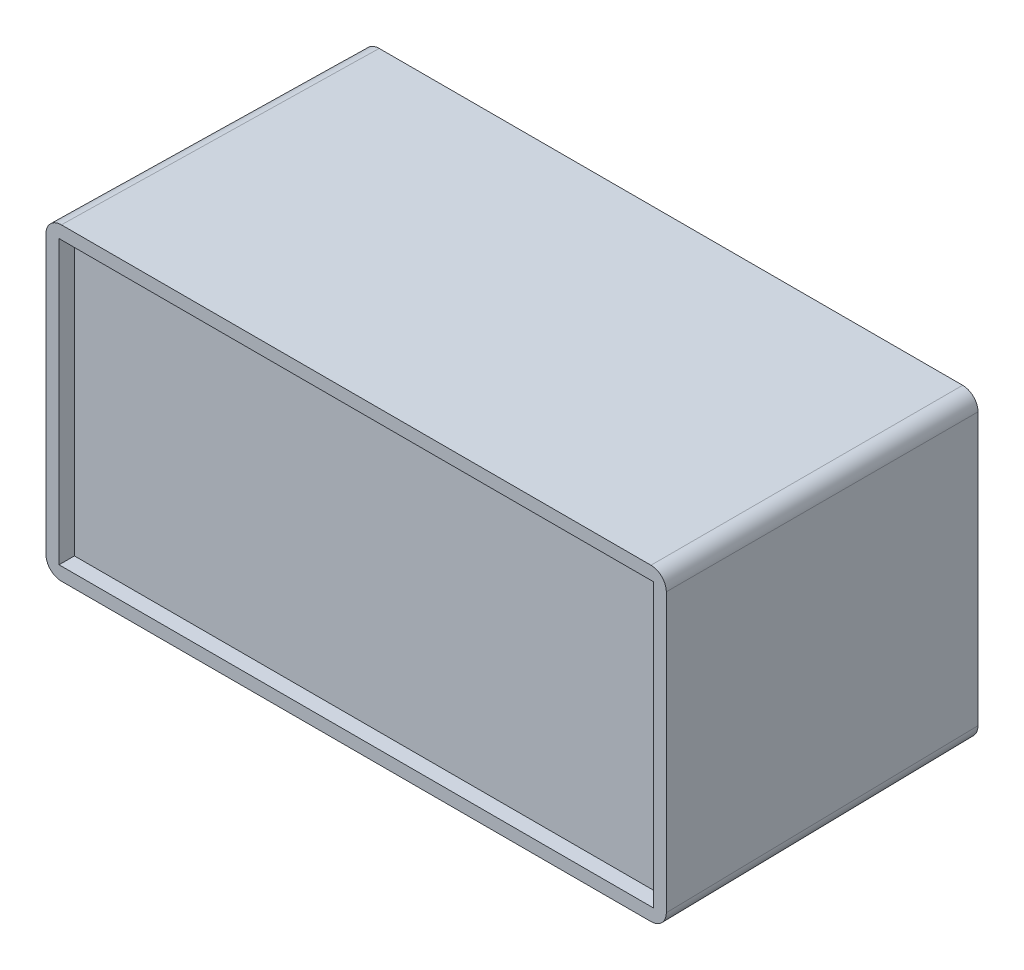
ISO-10303-21;
HEADER;
FILE_DESCRIPTION(('STEP AP214'),'2;1');
FILE_NAME('part.step','',(''),(''),'','','');
FILE_SCHEMA(('AUTOMOTIVE_DESIGN { 1 0 10303 214 1 1 1 1 }'));
ENDSEC;
DATA;
#1=APPLICATION_CONTEXT('core data for automotive mechanical design processes');
#2=APPLICATION_PROTOCOL_DEFINITION('international standard','automotive_design',2000,#1);
#3=PRODUCT_CONTEXT('',#1,'mechanical');
#4=PRODUCT('Part','Part','',(#3));
#5=PRODUCT_RELATED_PRODUCT_CATEGORY('part','',(#4));
#6=PRODUCT_DEFINITION_FORMATION('','',#4);
#7=PRODUCT_DEFINITION_CONTEXT('part definition',#1,'design');
#8=PRODUCT_DEFINITION('design','',#6,#7);
#9=PRODUCT_DEFINITION_SHAPE('','',#8);
#10=(LENGTH_UNIT() NAMED_UNIT(*) SI_UNIT(.MILLI.,.METRE.));
#11=(NAMED_UNIT(*) PLANE_ANGLE_UNIT() SI_UNIT($,.RADIAN.));
#12=(NAMED_UNIT(*) SI_UNIT($,.STERADIAN.) SOLID_ANGLE_UNIT());
#13=UNCERTAINTY_MEASURE_WITH_UNIT(LENGTH_MEASURE(1.E-05),#10,'distance_accuracy_value','');
#14=(GEOMETRIC_REPRESENTATION_CONTEXT(3) GLOBAL_UNCERTAINTY_ASSIGNED_CONTEXT((#13)) GLOBAL_UNIT_ASSIGNED_CONTEXT((#10,
#11,#12)) REPRESENTATION_CONTEXT('',''));
#15=CARTESIAN_POINT('',(0.,0.,0.));
#16=DIRECTION('',(0.,0.,1.));
#17=DIRECTION('',(1.,0.,0.));
#18=AXIS2_PLACEMENT_3D('',#15,#16,#17);
#19=CARTESIAN_POINT('',(0.,0.,19.5));
#20=DIRECTION('',(0.,0.,-1.));
#21=DIRECTION('',(-1.,0.,0.));
#22=AXIS2_PLACEMENT_3D('',#19,#20,#21);
#23=PLANE('',#22);
#24=DIRECTION('',(1.,0.,0.));
#25=VECTOR('',#24,1.);
#26=CARTESIAN_POINT('',(19.35,9.2,19.5));
#27=LINE('',#26,#25);
#28=CARTESIAN_POINT('',(19.35,9.2,19.5));
#29=VERTEX_POINT('',#28);
#30=CARTESIAN_POINT('',(-19.35,9.2,19.5));
#31=VERTEX_POINT('',#30);
#32=EDGE_CURVE('E166',#29,#31,#27,.F.);
#33=ORIENTED_EDGE('',*,*,#32,.T.);
#34=DIRECTION('',(0.,1.,0.));
#35=VECTOR('',#34,1.);
#36=CARTESIAN_POINT('',(-19.35,9.2,19.5));
#37=LINE('',#36,#35);
#38=CARTESIAN_POINT('',(-19.35,-9.2,19.5));
#39=VERTEX_POINT('',#38);
#40=EDGE_CURVE('E151',#31,#39,#37,.F.);
#41=ORIENTED_EDGE('',*,*,#40,.T.);
#42=DIRECTION('',(1.,0.,0.));
#43=VECTOR('',#42,1.);
#44=CARTESIAN_POINT('',(19.35,-9.2,19.5));
#45=LINE('',#44,#43);
#46=CARTESIAN_POINT('',(19.35,-9.2,19.5));
#47=VERTEX_POINT('',#46);
#48=EDGE_CURVE('E157',#39,#47,#45,.T.);
#49=ORIENTED_EDGE('',*,*,#48,.T.);
#50=DIRECTION('',(0.,1.,0.));
#51=VECTOR('',#50,1.);
#52=CARTESIAN_POINT('',(19.35,9.2,19.5));
#53=LINE('',#52,#51);
#54=EDGE_CURVE('E163',#47,#29,#53,.T.);
#55=ORIENTED_EDGE('',*,*,#54,.T.);
#56=EDGE_LOOP('',(#33,#41,#49,#55));
#57=FACE_BOUND('',#56,.T.);
#58=ADVANCED_FACE('F17',(#57),#23,.F.);
#59=CARTESIAN_POINT('',(19.35,9.2,19.5));
#60=DIRECTION('',(0.,1.,0.));
#61=DIRECTION('',(0.,0.,1.));
#62=AXIS2_PLACEMENT_3D('',#59,#60,#61);
#63=PLANE('',#62);
#64=DIRECTION('',(1.,0.,0.));
#65=VECTOR('',#64,1.);
#66=CARTESIAN_POINT('',(0.,9.2,20.5));
#67=LINE('',#66,#65);
#68=CARTESIAN_POINT('',(-19.35,9.2,20.5));
#69=VERTEX_POINT('',#68);
#70=CARTESIAN_POINT('',(19.35,9.2,20.5));
#71=VERTEX_POINT('',#70);
#72=EDGE_CURVE('E131',#69,#71,#67,.T.);
#73=ORIENTED_EDGE('',*,*,#72,.F.);
#74=DIRECTION('',(0.,0.,1.));
#75=VECTOR('',#74,1.);
#76=CARTESIAN_POINT('',(-19.35,9.2,19.5));
#77=LINE('',#76,#75);
#78=EDGE_CURVE('E145',#69,#31,#77,.F.);
#79=ORIENTED_EDGE('',*,*,#78,.T.);
#80=ORIENTED_EDGE('',*,*,#32,.F.);
#81=DIRECTION('',(0.,0.,-1.));
#82=VECTOR('',#81,1.);
#83=CARTESIAN_POINT('',(19.35,9.2,19.5));
#84=LINE('',#83,#82);
#85=EDGE_CURVE('E160',#29,#71,#84,.F.);
#86=ORIENTED_EDGE('',*,*,#85,.T.);
#87=EDGE_LOOP('',(#73,#79,#80,#86));
#88=FACE_BOUND('',#87,.T.);
#89=ADVANCED_FACE('F317',(#88),#63,.F.);
#90=CARTESIAN_POINT('',(19.35,9.2,19.5));
#91=DIRECTION('',(1.,0.,0.));
#92=DIRECTION('',(0.,0.,-1.));
#93=AXIS2_PLACEMENT_3D('',#90,#91,#92);
#94=PLANE('',#93);
#95=ORIENTED_EDGE('',*,*,#54,.F.);
#96=DIRECTION('',(0.,0.,-1.));
#97=VECTOR('',#96,1.);
#98=CARTESIAN_POINT('',(19.35,-9.2,19.5));
#99=LINE('',#98,#97);
#100=CARTESIAN_POINT('',(19.35,-9.2,20.5));
#101=VERTEX_POINT('',#100);
#102=EDGE_CURVE('E154',#47,#101,#99,.F.);
#103=ORIENTED_EDGE('',*,*,#102,.T.);
#104=DIRECTION('',(0.,1.,0.));
#105=VECTOR('',#104,1.);
#106=CARTESIAN_POINT('',(19.35,0.,20.5));
#107=LINE('',#106,#105);
#108=EDGE_CURVE('E128',#71,#101,#107,.F.);
#109=ORIENTED_EDGE('',*,*,#108,.F.);
#110=ORIENTED_EDGE('',*,*,#85,.F.);
#111=EDGE_LOOP('',(#95,#103,#109,#110));
#112=FACE_BOUND('',#111,.T.);
#113=ADVANCED_FACE('F307',(#112),#94,.F.);
#114=CARTESIAN_POINT('',(19.35,-9.2,19.5));
#115=DIRECTION('',(0.,-1.,0.));
#116=DIRECTION('',(0.,0.,-1.));
#117=AXIS2_PLACEMENT_3D('',#114,#115,#116);
#118=PLANE('',#117);
#119=DIRECTION('',(1.,0.,0.));
#120=VECTOR('',#119,1.);
#121=CARTESIAN_POINT('',(0.,-9.2,20.5));
#122=LINE('',#121,#120);
#123=CARTESIAN_POINT('',(-19.35,-9.2,20.5));
#124=VERTEX_POINT('',#123);
#125=EDGE_CURVE('E125',#101,#124,#122,.F.);
#126=ORIENTED_EDGE('',*,*,#125,.F.);
#127=ORIENTED_EDGE('',*,*,#102,.F.);
#128=ORIENTED_EDGE('',*,*,#48,.F.);
#129=DIRECTION('',(0.,0.,1.));
#130=VECTOR('',#129,1.);
#131=CARTESIAN_POINT('',(-19.35,-9.2,19.5));
#132=LINE('',#131,#130);
#133=EDGE_CURVE('E148',#39,#124,#132,.T.);
#134=ORIENTED_EDGE('',*,*,#133,.T.);
#135=EDGE_LOOP('',(#126,#127,#128,#134));
#136=FACE_BOUND('',#135,.T.);
#137=ADVANCED_FACE('F297',(#136),#118,.F.);
#138=CARTESIAN_POINT('',(-19.35,9.2,19.5));
#139=DIRECTION('',(-1.,0.,0.));
#140=DIRECTION('',(0.,0.,1.));
#141=AXIS2_PLACEMENT_3D('',#138,#139,#140);
#142=PLANE('',#141);
#143=DIRECTION('',(0.,1.,0.));
#144=VECTOR('',#143,1.);
#145=CARTESIAN_POINT('',(-19.35,0.,20.5));
#146=LINE('',#145,#144);
#147=EDGE_CURVE('E121',#124,#69,#146,.T.);
#148=ORIENTED_EDGE('',*,*,#147,.F.);
#149=ORIENTED_EDGE('',*,*,#133,.F.);
#150=ORIENTED_EDGE('',*,*,#40,.F.);
#151=ORIENTED_EDGE('',*,*,#78,.F.);
#152=EDGE_LOOP('',(#148,#149,#150,#151));
#153=FACE_BOUND('',#152,.T.);
#154=ADVANCED_FACE('F288',(#153),#142,.F.);
#155=CARTESIAN_POINT('',(-18.9973021209,8.847302120895,-0.2716546755297));
#156=DIRECTION('',(-0.00975516909412185,0.00975516909412185,0.999904832147485));
#157=DIRECTION('',(0.999952412677236,0.,0.00975563329441211));
#158=AXIS2_PLACEMENT_3D('',#155,#156,#157);
#159=CYLINDRICAL_SURFACE('',#158,1.);
#160=DIRECTION('',(0.00975516909412174,-0.00975516909412208,-0.999904832147485));
#161=VECTOR('',#160,1.);
#162=CARTESIAN_POINT('',(-19.20004758732,10.0499999999996,20.5));
#163=LINE('',#162,#161);
#164=CARTESIAN_POINT('',(-19.2000475873238,10.0499999999997,20.5));
#165=VERTEX_POINT('',#164);
#166=CARTESIAN_POINT('',(-19.0000475873238,9.8499999999997,0.));
#167=VERTEX_POINT('',#166);
#168=EDGE_CURVE('E141',#165,#167,#163,.T.);
#169=ORIENTED_EDGE('',*,*,#168,.T.);
#170=CARTESIAN_POINT('',(-18.9999524104174,8.84995241041236,0.));
#171=DIRECTION('',(0.,0.,-1.));
#172=DIRECTION('',(-0.707106781186548,0.707106781186548,0.));
#173=AXIS2_PLACEMENT_3D('',#170,#171,#172);
#174=ELLIPSE('',#173,1.0000951769103,1.);
#175=CARTESIAN_POINT('',(-20.0000000000022,8.85004758732278,0.));
#176=VERTEX_POINT('',#175);
#177=EDGE_CURVE('E20',#167,#176,#174,.F.);
#178=ORIENTED_EDGE('',*,*,#177,.T.);
#179=DIRECTION('',(-0.00975516909412208,0.00975516909412183,0.999904832147485));
#180=VECTOR('',#179,1.);
#181=CARTESIAN_POINT('',(-19.9999999999995,8.850047587323,0.));
#182=LINE('',#181,#180);
#183=CARTESIAN_POINT('',(-20.2000000000021,9.05004758732278,20.5));
#184=VERTEX_POINT('',#183);
#185=EDGE_CURVE('E119',#176,#184,#182,.T.);
#186=ORIENTED_EDGE('',*,*,#185,.T.);
#187=CARTESIAN_POINT('',(-19.1999524104173,9.04995241041236,20.5));
#188=DIRECTION('',(0.,0.,1.));
#189=DIRECTION('',(-0.707106781186548,0.707106781186548,0.));
#190=AXIS2_PLACEMENT_3D('',#187,#188,#189);
#191=ELLIPSE('',#190,1.0000951769103,1.);
#192=EDGE_CURVE('E134',#165,#184,#191,.T.);
#193=ORIENTED_EDGE('',*,*,#192,.F.);
#194=EDGE_LOOP('',(#169,#178,#186,#193));
#195=FACE_BOUND('',#194,.T.);
#196=ADVANCED_FACE('F198',(#195),#159,.T.);
#197=CARTESIAN_POINT('',(18.9973021209,8.847302120895,-0.2716546755297));
#198=DIRECTION('',(0.00975516909412185,0.00975516909412185,0.999904832147485));
#199=DIRECTION('',(0.999952412677236,0.,-0.00975563329441211));
#200=AXIS2_PLACEMENT_3D('',#197,#198,#199);
#201=CYLINDRICAL_SURFACE('',#200,1.);
#202=DIRECTION('',(-0.00975516909412208,-0.00975516909412183,-0.999904832147485));
#203=VECTOR('',#202,1.);
#204=CARTESIAN_POINT('',(20.1999999999995,9.050047587323,20.5));
#205=LINE('',#204,#203);
#206=CARTESIAN_POINT('',(20.2000000000021,9.05004758732278,20.5));
#207=VERTEX_POINT('',#206);
#208=CARTESIAN_POINT('',(20.0000000000022,8.85004758732278,0.));
#209=VERTEX_POINT('',#208);
#210=EDGE_CURVE('E111',#207,#209,#205,.T.);
#211=ORIENTED_EDGE('',*,*,#210,.T.);
#212=CARTESIAN_POINT('',(18.9999524104174,8.84995241041236,0.));
#213=DIRECTION('',(0.,0.,-1.));
#214=DIRECTION('',(0.707106781186548,0.707106781186548,0.));
#215=AXIS2_PLACEMENT_3D('',#212,#213,#214);
#216=ELLIPSE('',#215,1.0000951769103,1.);
#217=CARTESIAN_POINT('',(19.0000475873238,9.8499999999997,0.));
#218=VERTEX_POINT('',#217);
#219=EDGE_CURVE('E175',#209,#218,#216,.F.);
#220=ORIENTED_EDGE('',*,*,#219,.T.);
#221=DIRECTION('',(0.00975516909412174,0.00975516909412208,0.999904832147485));
#222=VECTOR('',#221,1.);
#223=CARTESIAN_POINT('',(19.00004758732,9.84999999999961,0.));
#224=LINE('',#223,#222);
#225=CARTESIAN_POINT('',(19.2000475873238,10.0499999999997,20.5));
#226=VERTEX_POINT('',#225);
#227=EDGE_CURVE('E142',#218,#226,#224,.T.);
#228=ORIENTED_EDGE('',*,*,#227,.T.);
#229=CARTESIAN_POINT('',(19.1999524104173,9.04995241041236,20.5));
#230=DIRECTION('',(0.,0.,1.));
#231=DIRECTION('',(0.707106781186548,0.707106781186548,0.));
#232=AXIS2_PLACEMENT_3D('',#229,#230,#231);
#233=ELLIPSE('',#232,1.0000951769103,1.);
#234=EDGE_CURVE('E173',#207,#226,#233,.T.);
#235=ORIENTED_EDGE('',*,*,#234,.F.);
#236=EDGE_LOOP('',(#211,#220,#228,#235));
#237=FACE_BOUND('',#236,.T.);
#238=ADVANCED_FACE('F178',(#237),#201,.T.);
#239=CARTESIAN_POINT('',(0.,0.,20.5));
#240=DIRECTION('',(0.,0.,1.));
#241=DIRECTION('',(1.,0.,0.));
#242=AXIS2_PLACEMENT_3D('',#239,#240,#241);
#243=PLANE('',#242);
#244=ORIENTED_EDGE('',*,*,#125,.T.);
#245=ORIENTED_EDGE('',*,*,#147,.T.);
#246=ORIENTED_EDGE('',*,*,#72,.T.);
#247=ORIENTED_EDGE('',*,*,#108,.T.);
#248=EDGE_LOOP('',(#244,#245,#246,#247));
#249=FACE_BOUND('',#248,.T.);
#250=ORIENTED_EDGE('',*,*,#192,.T.);
#251=DIRECTION('',(0.,1.,0.));
#252=VECTOR('',#251,1.);
#253=CARTESIAN_POINT('',(-20.1999999999995,0.,20.5));
#254=LINE('',#253,#252);
#255=CARTESIAN_POINT('',(-20.2000000000021,-9.05004758732278,20.5));
#256=VERTEX_POINT('',#255);
#257=EDGE_CURVE('E97',#184,#256,#254,.F.);
#258=ORIENTED_EDGE('',*,*,#257,.T.);
#259=CARTESIAN_POINT('',(-19.1999524104173,-9.04995241041236,20.5));
#260=DIRECTION('',(0.,0.,1.));
#261=DIRECTION('',(-0.707106781186548,-0.707106781186548,0.));
#262=AXIS2_PLACEMENT_3D('',#259,#260,#261);
#263=ELLIPSE('',#262,1.0000951769103,1.);
#264=CARTESIAN_POINT('',(-19.2000475873238,-10.0499999999997,20.5));
#265=VERTEX_POINT('',#264);
#266=EDGE_CURVE('E89',#265,#256,#263,.F.);
#267=ORIENTED_EDGE('',*,*,#266,.F.);
#268=DIRECTION('',(1.,0.,0.));
#269=VECTOR('',#268,1.);
#270=CARTESIAN_POINT('',(0.,-10.0499999999996,20.5));
#271=LINE('',#270,#269);
#272=CARTESIAN_POINT('',(19.2000475873238,-10.0499999999997,20.5));
#273=VERTEX_POINT('',#272);
#274=EDGE_CURVE('E94',#265,#273,#271,.T.);
#275=ORIENTED_EDGE('',*,*,#274,.T.);
#276=CARTESIAN_POINT('',(19.1999524104173,-9.04995241041236,20.5));
#277=DIRECTION('',(0.,0.,1.));
#278=DIRECTION('',(0.707106781186548,-0.707106781186548,0.));
#279=AXIS2_PLACEMENT_3D('',#276,#277,#278);
#280=ELLIPSE('',#279,1.0000951769103,1.);
#281=CARTESIAN_POINT('',(20.2000000000021,-9.05004758732278,20.5));
#282=VERTEX_POINT('',#281);
#283=EDGE_CURVE('E124',#282,#273,#280,.F.);
#284=ORIENTED_EDGE('',*,*,#283,.F.);
#285=DIRECTION('',(0.,1.,0.));
#286=VECTOR('',#285,1.);
#287=CARTESIAN_POINT('',(20.1999999999995,0.,20.5));
#288=LINE('',#287,#286);
#289=EDGE_CURVE('E115',#282,#207,#288,.T.);
#290=ORIENTED_EDGE('',*,*,#289,.T.);
#291=ORIENTED_EDGE('',*,*,#234,.T.);
#292=DIRECTION('',(1.,0.,0.));
#293=VECTOR('',#292,1.);
#294=CARTESIAN_POINT('',(0.,10.0499999999996,20.5));
#295=LINE('',#294,#293);
#296=EDGE_CURVE('E138',#226,#165,#295,.F.);
#297=ORIENTED_EDGE('',*,*,#296,.T.);
#298=EDGE_LOOP('',(#250,#258,#267,#275,#284,#290,#291,#297));
#299=FACE_BOUND('',#298,.T.);
#300=ADVANCED_FACE('F92',(#249,#299),#243,.T.);
#301=CARTESIAN_POINT('',(18.9973021209,-8.847302120895,-0.2716546755297));
#302=DIRECTION('',(0.00975516909412185,-0.00975516909412185,0.999904832147485));
#303=DIRECTION('',(0.999952412677236,0.,-0.00975563329441211));
#304=AXIS2_PLACEMENT_3D('',#301,#302,#303);
#305=CYLINDRICAL_SURFACE('',#304,1.);
#306=DIRECTION('',(-0.00975516909412174,0.00975516909412208,-0.999904832147485));
#307=VECTOR('',#306,1.);
#308=CARTESIAN_POINT('',(19.20004758732,-10.0499999999996,20.5));
#309=LINE('',#308,#307);
#310=CARTESIAN_POINT('',(19.0000475873238,-9.8499999999997,0.));
#311=VERTEX_POINT('',#310);
#312=EDGE_CURVE('E107',#273,#311,#309,.T.);
#313=ORIENTED_EDGE('',*,*,#312,.T.);
#314=CARTESIAN_POINT('',(18.9999524104174,-8.84995241041236,0.));
#315=DIRECTION('',(0.,0.,-1.));
#316=DIRECTION('',(0.707106781186548,-0.707106781186548,0.));
#317=AXIS2_PLACEMENT_3D('',#314,#315,#316);
#318=ELLIPSE('',#317,1.0000951769103,1.);
#319=CARTESIAN_POINT('',(20.0000000000022,-8.85004758732278,0.));
#320=VERTEX_POINT('',#319);
#321=EDGE_CURVE('E34',#311,#320,#318,.F.);
#322=ORIENTED_EDGE('',*,*,#321,.T.);
#323=DIRECTION('',(0.00975516909412208,-0.00975516909412183,0.999904832147485));
#324=VECTOR('',#323,1.);
#325=CARTESIAN_POINT('',(19.9999999999995,-8.850047587323,0.));
#326=LINE('',#325,#324);
#327=EDGE_CURVE('E137',#320,#282,#326,.T.);
#328=ORIENTED_EDGE('',*,*,#327,.T.);
#329=ORIENTED_EDGE('',*,*,#283,.T.);
#330=EDGE_LOOP('',(#313,#322,#328,#329));
#331=FACE_BOUND('',#330,.T.);
#332=ADVANCED_FACE('F204',(#331),#305,.T.);
#333=CARTESIAN_POINT('',(-18.9973021209,-8.847302120895,-0.2716546755297));
#334=DIRECTION('',(-0.00975516909412185,-0.00975516909412185,0.999904832147485));
#335=DIRECTION('',(0.999952412677236,0.,0.00975563329441211));
#336=AXIS2_PLACEMENT_3D('',#333,#334,#335);
#337=CYLINDRICAL_SURFACE('',#336,1.);
#338=DIRECTION('',(0.00975516909412208,0.00975516909412183,-0.999904832147485));
#339=VECTOR('',#338,1.);
#340=CARTESIAN_POINT('',(-20.1999999999995,-9.050047587323,20.5));
#341=LINE('',#340,#339);
#342=CARTESIAN_POINT('',(-20.0000000000022,-8.85004758732278,0.));
#343=VERTEX_POINT('',#342);
#344=EDGE_CURVE('E144',#256,#343,#341,.T.);
#345=ORIENTED_EDGE('',*,*,#344,.T.);
#346=CARTESIAN_POINT('',(-18.9999524104174,-8.84995241041236,0.));
#347=DIRECTION('',(0.,0.,-1.));
#348=DIRECTION('',(-0.707106781186548,-0.707106781186548,0.));
#349=AXIS2_PLACEMENT_3D('',#346,#347,#348);
#350=ELLIPSE('',#349,1.0000951769103,1.);
#351=CARTESIAN_POINT('',(-19.0000475873238,-9.8499999999997,0.));
#352=VERTEX_POINT('',#351);
#353=EDGE_CURVE('E79',#343,#352,#350,.F.);
#354=ORIENTED_EDGE('',*,*,#353,.T.);
#355=DIRECTION('',(-0.00975516909412174,-0.00975516909412208,0.999904832147485));
#356=VECTOR('',#355,1.);
#357=CARTESIAN_POINT('',(-19.00004758732,-9.84999999999961,0.));
#358=LINE('',#357,#356);
#359=EDGE_CURVE('E102',#352,#265,#358,.T.);
#360=ORIENTED_EDGE('',*,*,#359,.T.);
#361=ORIENTED_EDGE('',*,*,#266,.T.);
#362=EDGE_LOOP('',(#345,#354,#360,#361));
#363=FACE_BOUND('',#362,.T.);
#364=ADVANCED_FACE('F103',(#363),#337,.T.);
#365=CARTESIAN_POINT('',(-19.99809655238,0.,-0.1951033809988));
#366=DIRECTION('',(0.999952412677236,0.,0.00975563329441235));
#367=DIRECTION('',(0.00975563329441235,0.,-0.999952412677236));
#368=AXIS2_PLACEMENT_3D('',#365,#366,#367);
#369=PLANE('',#368);
#370=ORIENTED_EDGE('',*,*,#257,.F.);
#371=ORIENTED_EDGE('',*,*,#185,.F.);
#372=DIRECTION('',(0.,1.,0.));
#373=VECTOR('',#372,1.);
#374=CARTESIAN_POINT('',(-20.,0.,0.));
#375=LINE('',#374,#373);
#376=EDGE_CURVE('E106',#343,#176,#375,.T.);
#377=ORIENTED_EDGE('',*,*,#376,.F.);
#378=ORIENTED_EDGE('',*,*,#344,.F.);
#379=EDGE_LOOP('',(#370,#371,#377,#378));
#380=FACE_BOUND('',#379,.T.);
#381=ADVANCED_FACE('F197',(#380),#369,.F.);
#382=CARTESIAN_POINT('',(0.,9.849062552047,-0.09608841514193));
#383=DIRECTION('',(0.,-0.999952412677236,0.00975563329441235));
#384=DIRECTION('',(0.,-0.00975563329441235,-0.999952412677236));
#385=AXIS2_PLACEMENT_3D('',#382,#383,#384);
#386=PLANE('',#385);
#387=ORIENTED_EDGE('',*,*,#296,.F.);
#388=ORIENTED_EDGE('',*,*,#227,.F.);
#389=DIRECTION('',(-1.,0.,0.));
#390=VECTOR('',#389,1.);
#391=CARTESIAN_POINT('',(0.,9.85,0.));
#392=LINE('',#391,#390);
#393=EDGE_CURVE('E186',#167,#218,#392,.F.);
#394=ORIENTED_EDGE('',*,*,#393,.F.);
#395=ORIENTED_EDGE('',*,*,#168,.F.);
#396=EDGE_LOOP('',(#387,#388,#394,#395));
#397=FACE_BOUND('',#396,.T.);
#398=ADVANCED_FACE('F184',(#397),#386,.F.);
#399=CARTESIAN_POINT('',(19.99809655238,0.,-0.1951033809988));
#400=DIRECTION('',(-0.999952412677236,0.,0.00975563329441235));
#401=DIRECTION('',(0.00975563329441235,0.,0.999952412677236));
#402=AXIS2_PLACEMENT_3D('',#399,#400,#401);
#403=PLANE('',#402);
#404=ORIENTED_EDGE('',*,*,#289,.F.);
#405=ORIENTED_EDGE('',*,*,#327,.F.);
#406=DIRECTION('',(0.,1.,0.));
#407=VECTOR('',#406,1.);
#408=CARTESIAN_POINT('',(20.,0.,0.));
#409=LINE('',#408,#407);
#410=EDGE_CURVE('E26',#209,#320,#409,.F.);
#411=ORIENTED_EDGE('',*,*,#410,.F.);
#412=ORIENTED_EDGE('',*,*,#210,.F.);
#413=EDGE_LOOP('',(#404,#405,#411,#412));
#414=FACE_BOUND('',#413,.T.);
#415=ADVANCED_FACE('F202',(#414),#403,.F.);
#416=CARTESIAN_POINT('',(0.,-9.849062552047,-0.09608841514193));
#417=DIRECTION('',(0.,0.999952412677236,0.00975563329441235));
#418=DIRECTION('',(0.,-0.00975563329441235,0.999952412677236));
#419=AXIS2_PLACEMENT_3D('',#416,#417,#418);
#420=PLANE('',#419);
#421=DIRECTION('',(-1.,0.,0.));
#422=VECTOR('',#421,1.);
#423=CARTESIAN_POINT('',(0.,-9.85,0.));
#424=LINE('',#423,#422);
#425=EDGE_CURVE('E11',#311,#352,#424,.T.);
#426=ORIENTED_EDGE('',*,*,#425,.F.);
#427=ORIENTED_EDGE('',*,*,#312,.F.);
#428=ORIENTED_EDGE('',*,*,#274,.F.);
#429=ORIENTED_EDGE('',*,*,#359,.F.);
#430=EDGE_LOOP('',(#426,#427,#428,#429));
#431=FACE_BOUND('',#430,.T.);
#432=ADVANCED_FACE('F110',(#431),#420,.F.);
#433=CARTESIAN_POINT('',(0.,0.,0.));
#434=DIRECTION('',(0.,0.,-1.));
#435=DIRECTION('',(-1.,0.,0.));
#436=AXIS2_PLACEMENT_3D('',#433,#434,#435);
#437=PLANE('',#436);
#438=ORIENTED_EDGE('',*,*,#321,.F.);
#439=ORIENTED_EDGE('',*,*,#425,.T.);
#440=ORIENTED_EDGE('',*,*,#353,.F.);
#441=ORIENTED_EDGE('',*,*,#376,.T.);
#442=ORIENTED_EDGE('',*,*,#177,.F.);
#443=ORIENTED_EDGE('',*,*,#393,.T.);
#444=ORIENTED_EDGE('',*,*,#219,.F.);
#445=ORIENTED_EDGE('',*,*,#410,.T.);
#446=EDGE_LOOP('',(#438,#439,#440,#441,#442,#443,#444,#445));
#447=FACE_BOUND('',#446,.T.);
#448=ADVANCED_FACE('F188',(#447),#437,.T.);
#449=CLOSED_SHELL('',(#58,#89,#113,#137,#154,#196,#238,#300,#332,#364,#381,#398,#415,#432,#448));
#450=MANIFOLD_SOLID_BREP('B1',#449);
#451=ADVANCED_BREP_SHAPE_REPRESENTATION('',(#18,#450),#14);
#452=SHAPE_DEFINITION_REPRESENTATION(#9,#451);
ENDSEC;
END-ISO-10303-21;
